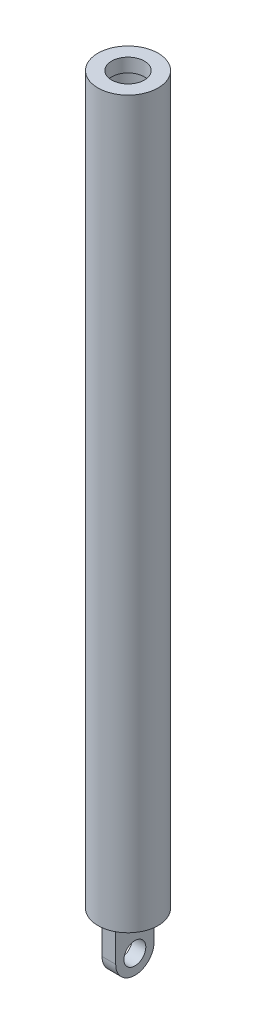
ISO-10303-21;
HEADER;
FILE_DESCRIPTION(('STEP AP214'),'2;1');
FILE_NAME('part.step','',(''),(''),'','','');
FILE_SCHEMA(('AUTOMOTIVE_DESIGN { 1 0 10303 214 1 1 1 1 }'));
ENDSEC;
DATA;
#1=APPLICATION_CONTEXT('core data for automotive mechanical design processes');
#2=APPLICATION_PROTOCOL_DEFINITION('international standard','automotive_design',2000,#1);
#3=PRODUCT_CONTEXT('',#1,'mechanical');
#4=PRODUCT('Part','Part','',(#3));
#5=PRODUCT_RELATED_PRODUCT_CATEGORY('part','',(#4));
#6=PRODUCT_DEFINITION_FORMATION('','',#4);
#7=PRODUCT_DEFINITION_CONTEXT('part definition',#1,'design');
#8=PRODUCT_DEFINITION('design','',#6,#7);
#9=PRODUCT_DEFINITION_SHAPE('','',#8);
#10=(LENGTH_UNIT() NAMED_UNIT(*) SI_UNIT(.MILLI.,.METRE.));
#11=(NAMED_UNIT(*) PLANE_ANGLE_UNIT() SI_UNIT($,.RADIAN.));
#12=(NAMED_UNIT(*) SI_UNIT($,.STERADIAN.) SOLID_ANGLE_UNIT());
#13=UNCERTAINTY_MEASURE_WITH_UNIT(LENGTH_MEASURE(1.E-05),#10,'distance_accuracy_value','');
#14=(GEOMETRIC_REPRESENTATION_CONTEXT(3) GLOBAL_UNCERTAINTY_ASSIGNED_CONTEXT((#13)) GLOBAL_UNIT_ASSIGNED_CONTEXT((#10,
#11,#12)) REPRESENTATION_CONTEXT('',''));
#15=CARTESIAN_POINT('',(0.,0.,0.));
#16=DIRECTION('',(0.,0.,1.));
#17=DIRECTION('',(1.,0.,0.));
#18=AXIS2_PLACEMENT_3D('',#15,#16,#17);
#19=CARTESIAN_POINT('',(0.,-12.,0.));
#20=DIRECTION('',(0.,-1.,0.));
#21=DIRECTION('',(0.,0.,-1.));
#22=AXIS2_PLACEMENT_3D('',#19,#20,#21);
#23=PLANE('',#22);
#24=CARTESIAN_POINT('',(0.,-12.,0.));
#25=DIRECTION('',(0.,-1.,0.));
#26=DIRECTION('',(0.,0.,-1.));
#27=AXIS2_PLACEMENT_3D('',#24,#25,#26);
#28=CIRCLE('',#27,11.);
#29=CARTESIAN_POINT('',(0.,-12.,-11.));
#30=VERTEX_POINT('',#29);
#31=EDGE_CURVE('E48',#30,#30,#28,.T.);
#32=ORIENTED_EDGE('',*,*,#31,.T.);
#33=EDGE_LOOP('',(#32));
#34=FACE_BOUND('',#33,.T.);
#35=DIRECTION('',(-1.,0.,0.));
#36=VECTOR('',#35,1.);
#37=CARTESIAN_POINT('',(2.5,-12.,-7.));
#38=LINE('',#37,#36);
#39=CARTESIAN_POINT('',(2.5,-12.,-7.));
#40=VERTEX_POINT('',#39);
#41=CARTESIAN_POINT('',(-2.5,-12.,-7.));
#42=VERTEX_POINT('',#41);
#43=EDGE_CURVE('E110',#40,#42,#38,.T.);
#44=ORIENTED_EDGE('',*,*,#43,.T.);
#45=DIRECTION('',(0.,0.,1.));
#46=VECTOR('',#45,1.);
#47=CARTESIAN_POINT('',(-2.5,-12.,7.));
#48=LINE('',#47,#46);
#49=CARTESIAN_POINT('',(-2.5,-12.,7.));
#50=VERTEX_POINT('',#49);
#51=EDGE_CURVE('E55',#42,#50,#48,.T.);
#52=ORIENTED_EDGE('',*,*,#51,.T.);
#53=DIRECTION('',(-1.,0.,0.));
#54=VECTOR('',#53,1.);
#55=CARTESIAN_POINT('',(2.5,-12.,7.));
#56=LINE('',#55,#54);
#57=CARTESIAN_POINT('',(2.5,-12.,7.));
#58=VERTEX_POINT('',#57);
#59=EDGE_CURVE('E103',#58,#50,#56,.T.);
#60=ORIENTED_EDGE('',*,*,#59,.F.);
#61=DIRECTION('',(0.,0.,1.));
#62=VECTOR('',#61,1.);
#63=CARTESIAN_POINT('',(2.5,-12.,7.));
#64=LINE('',#63,#62);
#65=EDGE_CURVE('E95',#40,#58,#64,.T.);
#66=ORIENTED_EDGE('',*,*,#65,.F.);
#67=EDGE_LOOP('',(#44,#52,#60,#66));
#68=FACE_BOUND('',#67,.T.);
#69=ADVANCED_FACE('F39',(#34,#68),#23,.T.);
#70=CARTESIAN_POINT('',(0.,248.,0.));
#71=DIRECTION('',(0.,-1.,0.));
#72=DIRECTION('',(0.,0.,-1.));
#73=AXIS2_PLACEMENT_3D('',#70,#71,#72);
#74=CYLINDRICAL_SURFACE('',#73,11.);
#75=ORIENTED_EDGE('',*,*,#31,.F.);
#76=EDGE_LOOP('',(#75));
#77=FACE_BOUND('',#76,.T.);
#78=CARTESIAN_POINT('',(0.,253.,0.));
#79=DIRECTION('',(0.,1.,0.));
#80=DIRECTION('',(0.,0.,1.));
#81=AXIS2_PLACEMENT_3D('',#78,#79,#80);
#82=CIRCLE('',#81,11.);
#83=CARTESIAN_POINT('',(0.,253.,11.));
#84=VERTEX_POINT('',#83);
#85=EDGE_CURVE('E137',#84,#84,#82,.T.);
#86=ORIENTED_EDGE('',*,*,#85,.F.);
#87=EDGE_LOOP('',(#86));
#88=FACE_BOUND('',#87,.T.);
#89=ADVANCED_FACE('F41',(#77,#88),#74,.T.);
#90=CARTESIAN_POINT('',(2.5,-25.,0.));
#91=DIRECTION('',(1.,0.,0.));
#92=DIRECTION('',(0.,0.,-1.));
#93=AXIS2_PLACEMENT_3D('',#90,#91,#92);
#94=PLANE('',#93);
#95=ORIENTED_EDGE('',*,*,#65,.T.);
#96=DIRECTION('',(0.,-1.,0.));
#97=VECTOR('',#96,1.);
#98=CARTESIAN_POINT('',(2.5,-12.,7.));
#99=LINE('',#98,#97);
#100=CARTESIAN_POINT('',(2.5,-25.,7.));
#101=VERTEX_POINT('',#100);
#102=EDGE_CURVE('E89',#58,#101,#99,.T.);
#103=ORIENTED_EDGE('',*,*,#102,.T.);
#104=CARTESIAN_POINT('',(2.5,-25.,0.));
#105=DIRECTION('',(1.,0.,0.));
#106=DIRECTION('',(0.,0.,-1.));
#107=AXIS2_PLACEMENT_3D('',#104,#105,#106);
#108=CIRCLE('',#107,7.);
#109=CARTESIAN_POINT('',(2.5,-25.,-7.));
#110=VERTEX_POINT('',#109);
#111=EDGE_CURVE('E93',#101,#110,#108,.T.);
#112=ORIENTED_EDGE('',*,*,#111,.T.);
#113=DIRECTION('',(0.,1.,0.));
#114=VECTOR('',#113,1.);
#115=CARTESIAN_POINT('',(2.5,-12.,-7.));
#116=LINE('',#115,#114);
#117=EDGE_CURVE('E64',#110,#40,#116,.T.);
#118=ORIENTED_EDGE('',*,*,#117,.T.);
#119=EDGE_LOOP('',(#95,#103,#112,#118));
#120=FACE_BOUND('',#119,.T.);
#121=CARTESIAN_POINT('',(2.5,-25.,0.));
#122=DIRECTION('',(1.,0.,0.));
#123=DIRECTION('',(0.,0.,-1.));
#124=AXIS2_PLACEMENT_3D('',#121,#122,#123);
#125=CIRCLE('',#124,4.);
#126=CARTESIAN_POINT('',(2.5,-25.,-4.));
#127=VERTEX_POINT('',#126);
#128=EDGE_CURVE('E116',#127,#127,#125,.T.);
#129=ORIENTED_EDGE('',*,*,#128,.F.);
#130=EDGE_LOOP('',(#129));
#131=FACE_BOUND('',#130,.T.);
#132=ADVANCED_FACE('F90',(#120,#131),#94,.T.);
#133=CARTESIAN_POINT('',(-2.5,-25.,0.));
#134=DIRECTION('',(1.,0.,0.));
#135=DIRECTION('',(0.,0.,-1.));
#136=AXIS2_PLACEMENT_3D('',#133,#134,#135);
#137=PLANE('',#136);
#138=ORIENTED_EDGE('',*,*,#51,.F.);
#139=DIRECTION('',(0.,1.,0.));
#140=VECTOR('',#139,1.);
#141=CARTESIAN_POINT('',(-2.5,-12.,-7.));
#142=LINE('',#141,#140);
#143=CARTESIAN_POINT('',(-2.5,-25.,-7.));
#144=VERTEX_POINT('',#143);
#145=EDGE_CURVE('E121',#144,#42,#142,.T.);
#146=ORIENTED_EDGE('',*,*,#145,.F.);
#147=CARTESIAN_POINT('',(-2.5,-25.,0.));
#148=DIRECTION('',(1.,0.,0.));
#149=DIRECTION('',(0.,0.,-1.));
#150=AXIS2_PLACEMENT_3D('',#147,#148,#149);
#151=CIRCLE('',#150,7.);
#152=CARTESIAN_POINT('',(-2.5,-25.,7.));
#153=VERTEX_POINT('',#152);
#154=EDGE_CURVE('E81',#153,#144,#151,.T.);
#155=ORIENTED_EDGE('',*,*,#154,.F.);
#156=DIRECTION('',(0.,-1.,0.));
#157=VECTOR('',#156,1.);
#158=CARTESIAN_POINT('',(-2.5,-12.,7.));
#159=LINE('',#158,#157);
#160=EDGE_CURVE('E101',#50,#153,#159,.T.);
#161=ORIENTED_EDGE('',*,*,#160,.F.);
#162=EDGE_LOOP('',(#138,#146,#155,#161));
#163=FACE_BOUND('',#162,.T.);
#164=CARTESIAN_POINT('',(-2.5,-25.,0.));
#165=DIRECTION('',(1.,0.,0.));
#166=DIRECTION('',(0.,0.,-1.));
#167=AXIS2_PLACEMENT_3D('',#164,#165,#166);
#168=CIRCLE('',#167,4.);
#169=CARTESIAN_POINT('',(-2.5,-25.,-4.));
#170=VERTEX_POINT('',#169);
#171=EDGE_CURVE('E136',#170,#170,#168,.T.);
#172=ORIENTED_EDGE('',*,*,#171,.T.);
#173=EDGE_LOOP('',(#172));
#174=FACE_BOUND('',#173,.T.);
#175=ADVANCED_FACE('F163',(#163,#174),#137,.F.);
#176=CARTESIAN_POINT('',(2.5,-12.,7.));
#177=DIRECTION('',(0.,0.,-1.));
#178=DIRECTION('',(0.,1.,0.));
#179=AXIS2_PLACEMENT_3D('',#176,#177,#178);
#180=PLANE('',#179);
#181=ORIENTED_EDGE('',*,*,#160,.T.);
#182=DIRECTION('',(-1.,0.,0.));
#183=VECTOR('',#182,1.);
#184=CARTESIAN_POINT('',(2.5,-25.,7.));
#185=LINE('',#184,#183);
#186=EDGE_CURVE('E99',#101,#153,#185,.T.);
#187=ORIENTED_EDGE('',*,*,#186,.F.);
#188=ORIENTED_EDGE('',*,*,#102,.F.);
#189=ORIENTED_EDGE('',*,*,#59,.T.);
#190=EDGE_LOOP('',(#181,#187,#188,#189));
#191=FACE_BOUND('',#190,.T.);
#192=ADVANCED_FACE('F100',(#191),#180,.F.);
#193=CARTESIAN_POINT('',(2.5,-25.,0.));
#194=DIRECTION('',(-1.,0.,0.));
#195=DIRECTION('',(0.,0.,1.));
#196=AXIS2_PLACEMENT_3D('',#193,#194,#195);
#197=CYLINDRICAL_SURFACE('',#196,7.);
#198=ORIENTED_EDGE('',*,*,#154,.T.);
#199=DIRECTION('',(-1.,0.,0.));
#200=VECTOR('',#199,1.);
#201=CARTESIAN_POINT('',(2.5,-25.,-7.));
#202=LINE('',#201,#200);
#203=EDGE_CURVE('E104',#110,#144,#202,.T.);
#204=ORIENTED_EDGE('',*,*,#203,.F.);
#205=ORIENTED_EDGE('',*,*,#111,.F.);
#206=ORIENTED_EDGE('',*,*,#186,.T.);
#207=EDGE_LOOP('',(#198,#204,#205,#206));
#208=FACE_BOUND('',#207,.T.);
#209=ADVANCED_FACE('F106',(#208),#197,.T.);
#210=CARTESIAN_POINT('',(2.5,-12.,-7.));
#211=DIRECTION('',(0.,0.,1.));
#212=DIRECTION('',(0.,-1.,0.));
#213=AXIS2_PLACEMENT_3D('',#210,#211,#212);
#214=PLANE('',#213);
#215=ORIENTED_EDGE('',*,*,#145,.T.);
#216=ORIENTED_EDGE('',*,*,#43,.F.);
#217=ORIENTED_EDGE('',*,*,#117,.F.);
#218=ORIENTED_EDGE('',*,*,#203,.T.);
#219=EDGE_LOOP('',(#215,#216,#217,#218));
#220=FACE_BOUND('',#219,.T.);
#221=ADVANCED_FACE('F224',(#220),#214,.F.);
#222=CARTESIAN_POINT('',(2.5,-25.,0.));
#223=DIRECTION('',(-1.,0.,0.));
#224=DIRECTION('',(0.,0.,1.));
#225=AXIS2_PLACEMENT_3D('',#222,#223,#224);
#226=CYLINDRICAL_SURFACE('',#225,4.);
#227=ORIENTED_EDGE('',*,*,#128,.T.);
#228=EDGE_LOOP('',(#227));
#229=FACE_BOUND('',#228,.T.);
#230=ORIENTED_EDGE('',*,*,#171,.F.);
#231=EDGE_LOOP('',(#230));
#232=FACE_BOUND('',#231,.T.);
#233=ADVANCED_FACE('F160',(#229,#232),#226,.F.);
#234=CARTESIAN_POINT('',(0.,248.,0.));
#235=DIRECTION('',(0.,1.,0.));
#236=DIRECTION('',(0.,0.,1.));
#237=AXIS2_PLACEMENT_3D('',#234,#235,#236);
#238=PLANE('',#237);
#239=CARTESIAN_POINT('',(0.,248.,0.));
#240=DIRECTION('',(0.,1.,0.));
#241=DIRECTION('',(0.,0.,1.));
#242=AXIS2_PLACEMENT_3D('',#239,#240,#241);
#243=CIRCLE('',#242,6.);
#244=CARTESIAN_POINT('',(0.,248.,6.));
#245=VERTEX_POINT('',#244);
#246=EDGE_CURVE('E151',#245,#245,#243,.T.);
#247=ORIENTED_EDGE('',*,*,#246,.T.);
#248=EDGE_LOOP('',(#247));
#249=FACE_BOUND('',#248,.T.);
#250=CARTESIAN_POINT('',(0.,248.,0.));
#251=DIRECTION('',(0.,1.,0.));
#252=DIRECTION('',(0.,0.,1.));
#253=AXIS2_PLACEMENT_3D('',#250,#251,#252);
#254=CIRCLE('',#253,9.);
#255=CARTESIAN_POINT('',(0.,248.,9.));
#256=VERTEX_POINT('',#255);
#257=EDGE_CURVE('E133',#256,#256,#254,.T.);
#258=ORIENTED_EDGE('',*,*,#257,.F.);
#259=EDGE_LOOP('',(#258));
#260=FACE_BOUND('',#259,.T.);
#261=ADVANCED_FACE('F209',(#249,#260),#238,.F.);
#262=CARTESIAN_POINT('',(0.,253.,0.));
#263=DIRECTION('',(0.,1.,0.));
#264=DIRECTION('',(0.,0.,1.));
#265=AXIS2_PLACEMENT_3D('',#262,#263,#264);
#266=PLANE('',#265);
#267=ORIENTED_EDGE('',*,*,#85,.T.);
#268=EDGE_LOOP('',(#267));
#269=FACE_BOUND('',#268,.T.);
#270=CARTESIAN_POINT('',(0.,253.,0.));
#271=DIRECTION('',(0.,1.,0.));
#272=DIRECTION('',(0.,0.,1.));
#273=AXIS2_PLACEMENT_3D('',#270,#271,#272);
#274=CIRCLE('',#273,6.);
#275=CARTESIAN_POINT('',(0.,253.,6.));
#276=VERTEX_POINT('',#275);
#277=EDGE_CURVE('E145',#276,#276,#274,.T.);
#278=ORIENTED_EDGE('',*,*,#277,.F.);
#279=EDGE_LOOP('',(#278));
#280=FACE_BOUND('',#279,.T.);
#281=ADVANCED_FACE('F201',(#269,#280),#266,.T.);
#282=CARTESIAN_POINT('',(0.,253.,0.));
#283=DIRECTION('',(0.,-1.,0.));
#284=DIRECTION('',(0.,0.,-1.));
#285=AXIS2_PLACEMENT_3D('',#282,#283,#284);
#286=CYLINDRICAL_SURFACE('',#285,6.);
#287=ORIENTED_EDGE('',*,*,#277,.T.);
#288=EDGE_LOOP('',(#287));
#289=FACE_BOUND('',#288,.T.);
#290=ORIENTED_EDGE('',*,*,#246,.F.);
#291=EDGE_LOOP('',(#290));
#292=FACE_BOUND('',#291,.T.);
#293=ADVANCED_FACE('F184',(#289,#292),#286,.F.);
#294=CARTESIAN_POINT('',(0.,0.,0.));
#295=DIRECTION('',(0.,-1.,0.));
#296=DIRECTION('',(0.,0.,-1.));
#297=AXIS2_PLACEMENT_3D('',#294,#295,#296);
#298=PLANE('',#297);
#299=CARTESIAN_POINT('',(0.,0.,0.));
#300=DIRECTION('',(0.,1.,0.));
#301=DIRECTION('',(0.,0.,1.));
#302=AXIS2_PLACEMENT_3D('',#299,#300,#301);
#303=CIRCLE('',#302,9.);
#304=CARTESIAN_POINT('',(0.,0.,9.));
#305=VERTEX_POINT('',#304);
#306=EDGE_CURVE('E11',#305,#305,#303,.T.);
#307=ORIENTED_EDGE('',*,*,#306,.T.);
#308=EDGE_LOOP('',(#307));
#309=FACE_BOUND('',#308,.T.);
#310=ADVANCED_FACE('F181',(#309),#298,.F.);
#311=CARTESIAN_POINT('',(0.,248.,0.));
#312=DIRECTION('',(0.,-1.,0.));
#313=DIRECTION('',(0.,0.,-1.));
#314=AXIS2_PLACEMENT_3D('',#311,#312,#313);
#315=CYLINDRICAL_SURFACE('',#314,9.);
#316=ORIENTED_EDGE('',*,*,#257,.T.);
#317=EDGE_LOOP('',(#316));
#318=FACE_BOUND('',#317,.T.);
#319=ORIENTED_EDGE('',*,*,#306,.F.);
#320=EDGE_LOOP('',(#319));
#321=FACE_BOUND('',#320,.T.);
#322=ADVANCED_FACE('F183',(#318,#321),#315,.F.);
#323=CLOSED_SHELL('',(#69,#89,#132,#175,#192,#209,#221,#233,#261,#281,#293,#310,#322));
#324=MANIFOLD_SOLID_BREP('B2',#323);
#325=ADVANCED_BREP_SHAPE_REPRESENTATION('',(#18,#324),#14);
#326=SHAPE_DEFINITION_REPRESENTATION(#9,#325);
ENDSEC;
END-ISO-10303-21;
